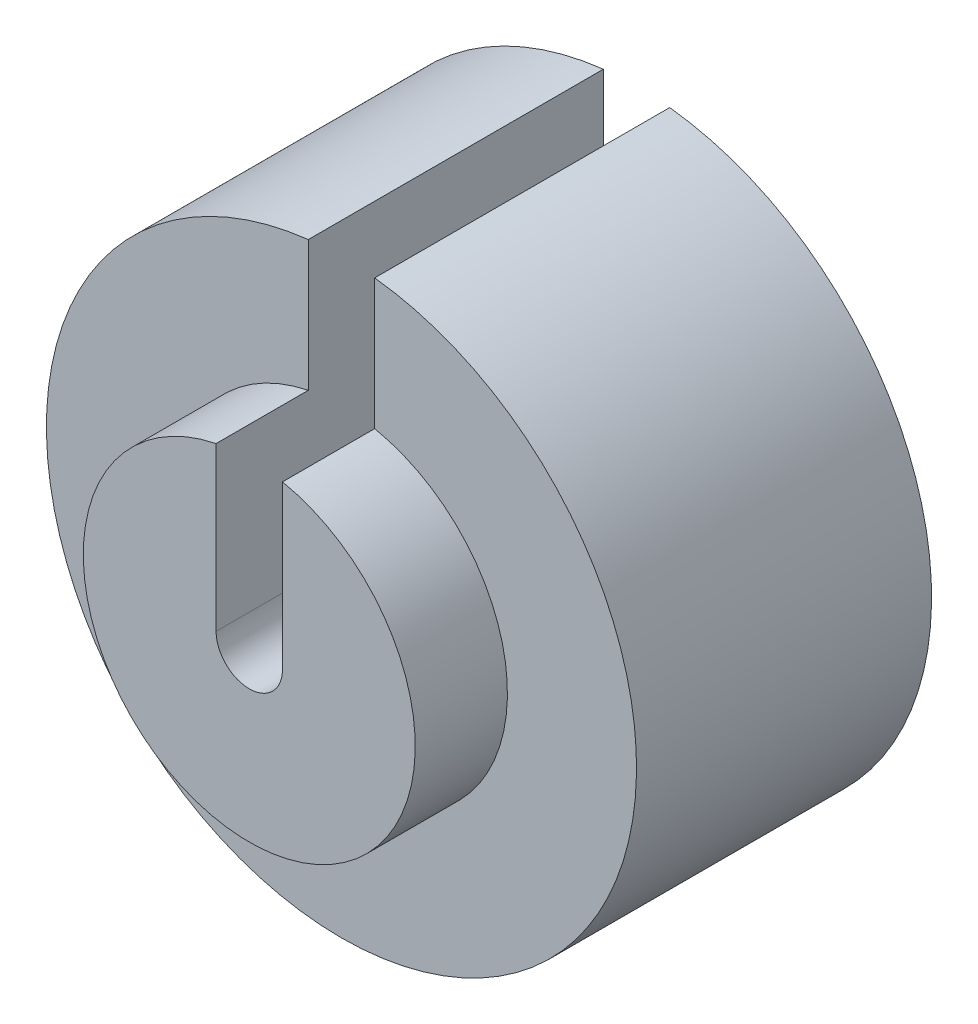
ISO-10303-21;
HEADER;
FILE_DESCRIPTION(('STEP AP214'),'2;1');
FILE_NAME('part.step','',(''),(''),'','','');
FILE_SCHEMA(('AUTOMOTIVE_DESIGN { 1 0 10303 214 1 1 1 1 }'));
ENDSEC;
DATA;
#1=APPLICATION_CONTEXT('core data for automotive mechanical design processes');
#2=APPLICATION_PROTOCOL_DEFINITION('international standard','automotive_design',2000,#1);
#3=PRODUCT_CONTEXT('',#1,'mechanical');
#4=PRODUCT('Part','Part','',(#3));
#5=PRODUCT_RELATED_PRODUCT_CATEGORY('part','',(#4));
#6=PRODUCT_DEFINITION_FORMATION('','',#4);
#7=PRODUCT_DEFINITION_CONTEXT('part definition',#1,'design');
#8=PRODUCT_DEFINITION('design','',#6,#7);
#9=PRODUCT_DEFINITION_SHAPE('','',#8);
#10=(LENGTH_UNIT() NAMED_UNIT(*) SI_UNIT(.MILLI.,.METRE.));
#11=(NAMED_UNIT(*) PLANE_ANGLE_UNIT() SI_UNIT($,.RADIAN.));
#12=(NAMED_UNIT(*) SI_UNIT($,.STERADIAN.) SOLID_ANGLE_UNIT());
#13=UNCERTAINTY_MEASURE_WITH_UNIT(LENGTH_MEASURE(1.E-05),#10,'distance_accuracy_value','');
#14=(GEOMETRIC_REPRESENTATION_CONTEXT(3) GLOBAL_UNCERTAINTY_ASSIGNED_CONTEXT((#13)) GLOBAL_UNIT_ASSIGNED_CONTEXT((#10,
#11,#12)) REPRESENTATION_CONTEXT('',''));
#15=CARTESIAN_POINT('',(0.,0.,0.));
#16=DIRECTION('',(0.,0.,1.));
#17=DIRECTION('',(1.,0.,0.));
#18=AXIS2_PLACEMENT_3D('',#15,#16,#17);
#19=CARTESIAN_POINT('',(0.,0.,0.));
#20=DIRECTION('',(0.,0.,1.));
#21=DIRECTION('',(1.,0.,0.));
#22=AXIS2_PLACEMENT_3D('',#19,#20,#21);
#23=PLANE('',#22);
#24=CARTESIAN_POINT('',(0.,0.,0.));
#25=DIRECTION('',(0.,0.,1.));
#26=DIRECTION('',(1.,0.,0.));
#27=AXIS2_PLACEMENT_3D('',#24,#25,#26);
#28=CIRCLE('',#27,0.4);
#29=CARTESIAN_POINT('',(-0.045,0.397460689880144,0.));
#30=VERTEX_POINT('',#29);
#31=CARTESIAN_POINT('',(0.045,0.397460689880144,0.));
#32=VERTEX_POINT('',#31);
#33=EDGE_CURVE('E36',#30,#32,#28,.T.);
#34=ORIENTED_EDGE('',*,*,#33,.F.);
#35=DIRECTION('',(0.,1.,0.));
#36=VECTOR('',#35,1.);
#37=CARTESIAN_POINT('',(-0.045,0.,0.));
#38=LINE('',#37,#36);
#39=CARTESIAN_POINT('',(-0.045,0.,0.));
#40=VERTEX_POINT('',#39);
#41=EDGE_CURVE('E124',#40,#30,#38,.T.);
#42=ORIENTED_EDGE('',*,*,#41,.F.);
#43=CARTESIAN_POINT('',(0.,0.,0.));
#44=DIRECTION('',(0.,0.,1.));
#45=DIRECTION('',(1.,0.,0.));
#46=AXIS2_PLACEMENT_3D('',#43,#44,#45);
#47=CIRCLE('',#46,0.045);
#48=CARTESIAN_POINT('',(0.045,0.,0.));
#49=VERTEX_POINT('',#48);
#50=EDGE_CURVE('E104',#40,#49,#47,.T.);
#51=ORIENTED_EDGE('',*,*,#50,.T.);
#52=DIRECTION('',(0.,-1.,0.));
#53=VECTOR('',#52,1.);
#54=CARTESIAN_POINT('',(0.045,0.,0.));
#55=LINE('',#54,#53);
#56=EDGE_CURVE('E49',#32,#49,#55,.T.);
#57=ORIENTED_EDGE('',*,*,#56,.F.);
#58=EDGE_LOOP('',(#34,#42,#51,#57));
#59=FACE_BOUND('',#58,.T.);
#60=ADVANCED_FACE('F32',(#59),#23,.F.);
#61=CARTESIAN_POINT('',(0.,0.,0.525));
#62=DIRECTION('',(0.,0.,-1.));
#63=DIRECTION('',(-1.,0.,0.));
#64=AXIS2_PLACEMENT_3D('',#61,#62,#63);
#65=PLANE('',#64);
#66=CARTESIAN_POINT('',(0.,0.,0.525));
#67=DIRECTION('',(0.,0.,1.));
#68=DIRECTION('',(1.,0.,0.));
#69=AXIS2_PLACEMENT_3D('',#66,#67,#68);
#70=CIRCLE('',#69,0.045);
#71=CARTESIAN_POINT('',(-0.045,0.,0.525));
#72=VERTEX_POINT('',#71);
#73=CARTESIAN_POINT('',(0.045,0.,0.525));
#74=VERTEX_POINT('',#73);
#75=EDGE_CURVE('E99',#72,#74,#70,.T.);
#76=ORIENTED_EDGE('',*,*,#75,.F.);
#77=DIRECTION('',(0.,1.,0.));
#78=VECTOR('',#77,1.);
#79=CARTESIAN_POINT('',(-0.045,0.,0.525));
#80=LINE('',#79,#78);
#81=CARTESIAN_POINT('',(-0.045,0.220454076850486,0.525));
#82=VERTEX_POINT('',#81);
#83=EDGE_CURVE('E57',#72,#82,#80,.T.);
#84=ORIENTED_EDGE('',*,*,#83,.T.);
#85=CARTESIAN_POINT('',(0.,0.,0.525));
#86=DIRECTION('',(0.,0.,-1.));
#87=DIRECTION('',(-1.,0.,0.));
#88=AXIS2_PLACEMENT_3D('',#85,#86,#87);
#89=CIRCLE('',#88,0.225);
#90=CARTESIAN_POINT('',(0.045,0.220454076850486,0.525));
#91=VERTEX_POINT('',#90);
#92=EDGE_CURVE('E101',#91,#82,#89,.T.);
#93=ORIENTED_EDGE('',*,*,#92,.F.);
#94=DIRECTION('',(0.,-1.,0.));
#95=VECTOR('',#94,1.);
#96=CARTESIAN_POINT('',(0.045,0.,0.525));
#97=LINE('',#96,#95);
#98=EDGE_CURVE('E87',#91,#74,#97,.T.);
#99=ORIENTED_EDGE('',*,*,#98,.T.);
#100=EDGE_LOOP('',(#76,#84,#93,#99));
#101=FACE_BOUND('',#100,.T.);
#102=ADVANCED_FACE('F98',(#101),#65,.F.);
#103=CARTESIAN_POINT('',(0.,0.,0.4));
#104=DIRECTION('',(0.,0.,-1.));
#105=DIRECTION('',(-1.,0.,0.));
#106=AXIS2_PLACEMENT_3D('',#103,#104,#105);
#107=CYLINDRICAL_SURFACE('',#106,0.4);
#108=CARTESIAN_POINT('',(0.,0.,0.4));
#109=DIRECTION('',(0.,0.,1.));
#110=DIRECTION('',(1.,0.,0.));
#111=AXIS2_PLACEMENT_3D('',#108,#109,#110);
#112=CIRCLE('',#111,0.4);
#113=CARTESIAN_POINT('',(-0.045,0.397460689880144,0.4));
#114=VERTEX_POINT('',#113);
#115=CARTESIAN_POINT('',(0.045,0.397460689880144,0.4));
#116=VERTEX_POINT('',#115);
#117=EDGE_CURVE('E41',#114,#116,#112,.T.);
#118=ORIENTED_EDGE('',*,*,#117,.F.);
#119=DIRECTION('',(0.,0.,-1.));
#120=VECTOR('',#119,1.);
#121=CARTESIAN_POINT('',(-0.045,0.397460689880144,0.4));
#122=LINE('',#121,#120);
#123=EDGE_CURVE('E107',#114,#30,#122,.T.);
#124=ORIENTED_EDGE('',*,*,#123,.T.);
#125=ORIENTED_EDGE('',*,*,#33,.T.);
#126=DIRECTION('',(0.,0.,-1.));
#127=VECTOR('',#126,1.);
#128=CARTESIAN_POINT('',(0.045,0.397460689880144,0.4));
#129=LINE('',#128,#127);
#130=EDGE_CURVE('E121',#32,#116,#129,.F.);
#131=ORIENTED_EDGE('',*,*,#130,.T.);
#132=EDGE_LOOP('',(#118,#124,#125,#131));
#133=FACE_BOUND('',#132,.T.);
#134=ADVANCED_FACE('F34',(#133),#107,.T.);
#135=CARTESIAN_POINT('',(0.,0.,0.4));
#136=DIRECTION('',(0.,0.,1.));
#137=DIRECTION('',(1.,0.,0.));
#138=AXIS2_PLACEMENT_3D('',#135,#136,#137);
#139=PLANE('',#138);
#140=DIRECTION('',(0.,-1.,0.));
#141=VECTOR('',#140,1.);
#142=CARTESIAN_POINT('',(-0.045,0.,0.4));
#143=LINE('',#142,#141);
#144=CARTESIAN_POINT('',(-0.045,0.220454076850486,0.4));
#145=VERTEX_POINT('',#144);
#146=EDGE_CURVE('E136',#114,#145,#143,.T.);
#147=ORIENTED_EDGE('',*,*,#146,.F.);
#148=ORIENTED_EDGE('',*,*,#117,.T.);
#149=DIRECTION('',(0.,1.,0.));
#150=VECTOR('',#149,1.);
#151=CARTESIAN_POINT('',(0.045,0.,0.4));
#152=LINE('',#151,#150);
#153=CARTESIAN_POINT('',(0.045,0.220454076850486,0.4));
#154=VERTEX_POINT('',#153);
#155=EDGE_CURVE('E132',#154,#116,#152,.T.);
#156=ORIENTED_EDGE('',*,*,#155,.F.);
#157=CARTESIAN_POINT('',(0.,0.,0.4));
#158=DIRECTION('',(0.,0.,1.));
#159=DIRECTION('',(1.,0.,0.));
#160=AXIS2_PLACEMENT_3D('',#157,#158,#159);
#161=CIRCLE('',#160,0.225);
#162=EDGE_CURVE('E11',#145,#154,#161,.T.);
#163=ORIENTED_EDGE('',*,*,#162,.F.);
#164=EDGE_LOOP('',(#147,#148,#156,#163));
#165=FACE_BOUND('',#164,.T.);
#166=ADVANCED_FACE('F142',(#165),#139,.T.);
#167=CARTESIAN_POINT('',(0.,0.,0.525));
#168=DIRECTION('',(0.,0.,-1.));
#169=DIRECTION('',(-1.,0.,0.));
#170=AXIS2_PLACEMENT_3D('',#167,#168,#169);
#171=CYLINDRICAL_SURFACE('',#170,0.225);
#172=DIRECTION('',(0.,0.,-1.));
#173=VECTOR('',#172,1.);
#174=CARTESIAN_POINT('',(-0.045,0.220454076850486,0.525));
#175=LINE('',#174,#173);
#176=EDGE_CURVE('E135',#145,#82,#175,.F.);
#177=ORIENTED_EDGE('',*,*,#176,.F.);
#178=ORIENTED_EDGE('',*,*,#162,.T.);
#179=DIRECTION('',(0.,0.,-1.));
#180=VECTOR('',#179,1.);
#181=CARTESIAN_POINT('',(0.045,0.220454076850486,0.525));
#182=LINE('',#181,#180);
#183=EDGE_CURVE('E129',#91,#154,#182,.T.);
#184=ORIENTED_EDGE('',*,*,#183,.F.);
#185=ORIENTED_EDGE('',*,*,#92,.T.);
#186=EDGE_LOOP('',(#177,#178,#184,#185));
#187=FACE_BOUND('',#186,.T.);
#188=ADVANCED_FACE('F141',(#187),#171,.T.);
#189=CARTESIAN_POINT('',(0.,0.,0.525));
#190=DIRECTION('',(0.,0.,-1.));
#191=DIRECTION('',(-1.,0.,0.));
#192=AXIS2_PLACEMENT_3D('',#189,#190,#191);
#193=CYLINDRICAL_SURFACE('',#192,0.045);
#194=DIRECTION('',(0.,0.,-1.));
#195=VECTOR('',#194,1.);
#196=CARTESIAN_POINT('',(-0.045,0.,0.525));
#197=LINE('',#196,#195);
#198=EDGE_CURVE('E93',#72,#40,#197,.T.);
#199=ORIENTED_EDGE('',*,*,#198,.F.);
#200=ORIENTED_EDGE('',*,*,#75,.T.);
#201=DIRECTION('',(0.,0.,-1.));
#202=VECTOR('',#201,1.);
#203=CARTESIAN_POINT('',(0.045,0.,0.525));
#204=LINE('',#203,#202);
#205=EDGE_CURVE('E84',#74,#49,#204,.T.);
#206=ORIENTED_EDGE('',*,*,#205,.T.);
#207=ORIENTED_EDGE('',*,*,#50,.F.);
#208=EDGE_LOOP('',(#199,#200,#206,#207));
#209=FACE_BOUND('',#208,.T.);
#210=ADVANCED_FACE('F103',(#209),#193,.F.);
#211=CARTESIAN_POINT('',(0.045,0.,0.525));
#212=DIRECTION('',(1.,0.,0.));
#213=DIRECTION('',(0.,0.,-1.));
#214=AXIS2_PLACEMENT_3D('',#211,#212,#213);
#215=PLANE('',#214);
#216=ORIENTED_EDGE('',*,*,#56,.T.);
#217=ORIENTED_EDGE('',*,*,#205,.F.);
#218=ORIENTED_EDGE('',*,*,#98,.F.);
#219=ORIENTED_EDGE('',*,*,#183,.T.);
#220=ORIENTED_EDGE('',*,*,#155,.T.);
#221=ORIENTED_EDGE('',*,*,#130,.F.);
#222=EDGE_LOOP('',(#216,#217,#218,#219,#220,#221));
#223=FACE_BOUND('',#222,.T.);
#224=ADVANCED_FACE('F86',(#223),#215,.F.);
#225=CARTESIAN_POINT('',(-0.045,0.,0.525));
#226=DIRECTION('',(-1.,0.,0.));
#227=DIRECTION('',(0.,0.,1.));
#228=AXIS2_PLACEMENT_3D('',#225,#226,#227);
#229=PLANE('',#228);
#230=ORIENTED_EDGE('',*,*,#146,.T.);
#231=ORIENTED_EDGE('',*,*,#176,.T.);
#232=ORIENTED_EDGE('',*,*,#83,.F.);
#233=ORIENTED_EDGE('',*,*,#198,.T.);
#234=ORIENTED_EDGE('',*,*,#41,.T.);
#235=ORIENTED_EDGE('',*,*,#123,.F.);
#236=EDGE_LOOP('',(#230,#231,#232,#233,#234,#235));
#237=FACE_BOUND('',#236,.T.);
#238=ADVANCED_FACE('F138',(#237),#229,.F.);
#239=CLOSED_SHELL('',(#60,#102,#134,#166,#188,#210,#224,#238));
#240=MANIFOLD_SOLID_BREP('B2',#239);
#241=ADVANCED_BREP_SHAPE_REPRESENTATION('',(#18,#240),#14);
#242=SHAPE_DEFINITION_REPRESENTATION(#9,#241);
ENDSEC;
END-ISO-10303-21;
